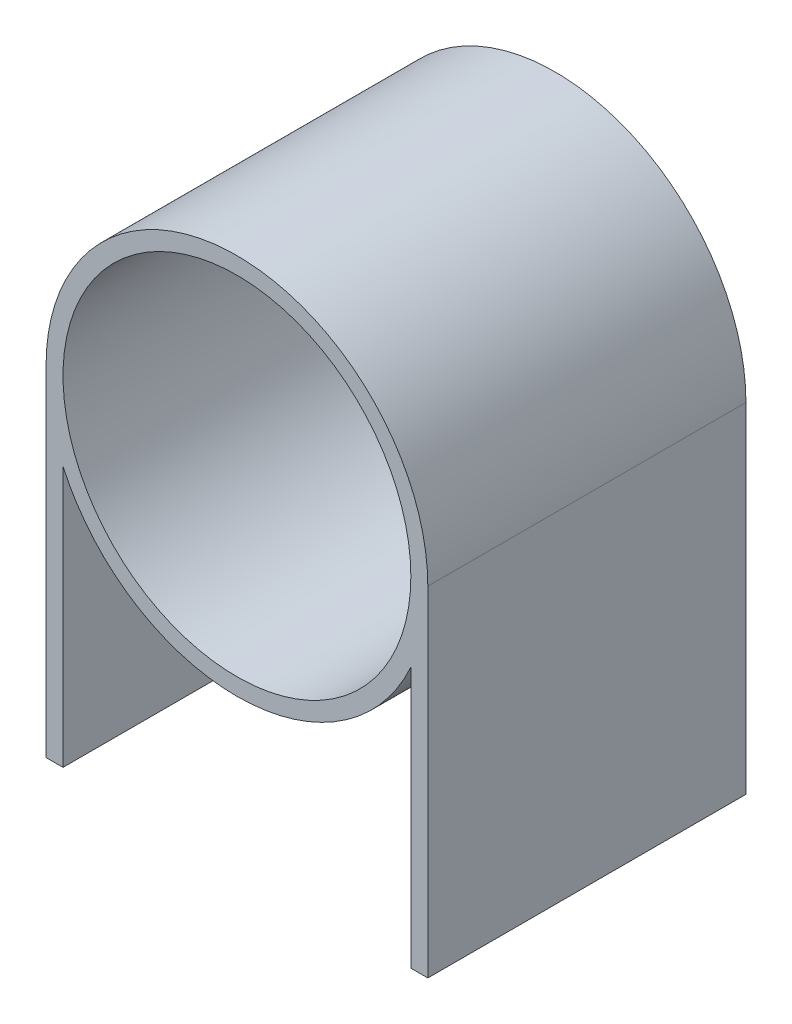
ISO-10303-21;
HEADER;
FILE_DESCRIPTION(('STEP AP214'),'2;1');
FILE_NAME('part.step','',(''),(''),'','','');
FILE_SCHEMA(('AUTOMOTIVE_DESIGN { 1 0 10303 214 1 1 1 1 }'));
ENDSEC;
DATA;
#1=APPLICATION_CONTEXT('core data for automotive mechanical design processes');
#2=APPLICATION_PROTOCOL_DEFINITION('international standard','automotive_design',2000,#1);
#3=PRODUCT_CONTEXT('',#1,'mechanical');
#4=PRODUCT('Part','Part','',(#3));
#5=PRODUCT_RELATED_PRODUCT_CATEGORY('part','',(#4));
#6=PRODUCT_DEFINITION_FORMATION('','',#4);
#7=PRODUCT_DEFINITION_CONTEXT('part definition',#1,'design');
#8=PRODUCT_DEFINITION('design','',#6,#7);
#9=PRODUCT_DEFINITION_SHAPE('','',#8);
#10=(LENGTH_UNIT() NAMED_UNIT(*) SI_UNIT(.MILLI.,.METRE.));
#11=(NAMED_UNIT(*) PLANE_ANGLE_UNIT() SI_UNIT($,.RADIAN.));
#12=(NAMED_UNIT(*) SI_UNIT($,.STERADIAN.) SOLID_ANGLE_UNIT());
#13=UNCERTAINTY_MEASURE_WITH_UNIT(LENGTH_MEASURE(1.E-05),#10,'distance_accuracy_value','');
#14=(GEOMETRIC_REPRESENTATION_CONTEXT(3) GLOBAL_UNCERTAINTY_ASSIGNED_CONTEXT((#13)) GLOBAL_UNIT_ASSIGNED_CONTEXT((#10,
#11,#12)) REPRESENTATION_CONTEXT('',''));
#15=CARTESIAN_POINT('',(0.,0.,0.));
#16=DIRECTION('',(0.,0.,1.));
#17=DIRECTION('',(1.,0.,0.));
#18=AXIS2_PLACEMENT_3D('',#15,#16,#17);
#19=CARTESIAN_POINT('',(-18.,-32.,30.));
#20=DIRECTION('',(0.,1.,0.));
#21=DIRECTION('',(-1.,0.,0.));
#22=AXIS2_PLACEMENT_3D('',#19,#20,#21);
#23=PLANE('',#22);
#24=DIRECTION('',(0.,0.,-1.));
#25=VECTOR('',#24,1.);
#26=CARTESIAN_POINT('',(-16.4,-32.,30.));
#27=LINE('',#26,#25);
#28=CARTESIAN_POINT('',(-16.4,-32.,30.));
#29=VERTEX_POINT('',#28);
#30=CARTESIAN_POINT('',(-16.4,-32.,1.6));
#31=VERTEX_POINT('',#30);
#32=EDGE_CURVE('E103',#29,#31,#27,.T.);
#33=ORIENTED_EDGE('',*,*,#32,.F.);
#34=DIRECTION('',(1.,0.,0.));
#35=VECTOR('',#34,1.);
#36=CARTESIAN_POINT('',(-18.,-32.,30.));
#37=LINE('',#36,#35);
#38=CARTESIAN_POINT('',(-18.,-32.,30.));
#39=VERTEX_POINT('',#38);
#40=EDGE_CURVE('E115',#39,#29,#37,.T.);
#41=ORIENTED_EDGE('',*,*,#40,.F.);
#42=DIRECTION('',(0.,0.,-1.));
#43=VECTOR('',#42,1.);
#44=CARTESIAN_POINT('',(-18.,-32.,30.));
#45=LINE('',#44,#43);
#46=CARTESIAN_POINT('',(-18.,-32.,0.));
#47=VERTEX_POINT('',#46);
#48=EDGE_CURVE('E60',#39,#47,#45,.T.);
#49=ORIENTED_EDGE('',*,*,#48,.T.);
#50=DIRECTION('',(1.,0.,0.));
#51=VECTOR('',#50,1.);
#52=CARTESIAN_POINT('',(-18.,-32.,0.));
#53=LINE('',#52,#51);
#54=CARTESIAN_POINT('',(18.,-32.,0.));
#55=VERTEX_POINT('',#54);
#56=EDGE_CURVE('E233',#47,#55,#53,.T.);
#57=ORIENTED_EDGE('',*,*,#56,.T.);
#58=DIRECTION('',(0.,0.,-1.));
#59=VECTOR('',#58,1.);
#60=CARTESIAN_POINT('',(18.,-32.,30.));
#61=LINE('',#60,#59);
#62=CARTESIAN_POINT('',(18.,-32.,30.));
#63=VERTEX_POINT('',#62);
#64=EDGE_CURVE('E243',#63,#55,#61,.T.);
#65=ORIENTED_EDGE('',*,*,#64,.F.);
#66=CARTESIAN_POINT('',(16.4,-32.,30.));
#67=VERTEX_POINT('',#66);
#68=EDGE_CURVE('E219',#67,#63,#37,.T.);
#69=ORIENTED_EDGE('',*,*,#68,.F.);
#70=DIRECTION('',(0.,0.,-1.));
#71=VECTOR('',#70,1.);
#72=CARTESIAN_POINT('',(16.4,-32.,30.));
#73=LINE('',#72,#71);
#74=CARTESIAN_POINT('',(16.4,-32.,1.6));
#75=VERTEX_POINT('',#74);
#76=EDGE_CURVE('E128',#67,#75,#73,.T.);
#77=ORIENTED_EDGE('',*,*,#76,.T.);
#78=DIRECTION('',(1.,0.,0.));
#79=VECTOR('',#78,1.);
#80=CARTESIAN_POINT('',(0.,-32.,1.6));
#81=LINE('',#80,#79);
#82=EDGE_CURVE('E120',#31,#75,#81,.T.);
#83=ORIENTED_EDGE('',*,*,#82,.F.);
#84=EDGE_LOOP('',(#33,#41,#49,#57,#65,#69,#77,#83));
#85=FACE_BOUND('',#84,.T.);
#86=ADVANCED_FACE('F49',(#85),#23,.F.);
#87=CARTESIAN_POINT('',(0.,0.,3.));
#88=DIRECTION('',(0.,0.,1.));
#89=DIRECTION('',(1.,0.,0.));
#90=AXIS2_PLACEMENT_3D('',#87,#88,#89);
#91=PLANE('',#90);
#92=CARTESIAN_POINT('',(1.27,0.,3.));
#93=DIRECTION('',(0.,0.,1.));
#94=DIRECTION('',(1.,0.,0.));
#95=AXIS2_PLACEMENT_3D('',#92,#93,#94);
#96=CIRCLE('',#95,0.75);
#97=CARTESIAN_POINT('',(2.02,0.,3.));
#98=VERTEX_POINT('',#97);
#99=EDGE_CURVE('E192',#98,#98,#96,.T.);
#100=ORIENTED_EDGE('',*,*,#99,.F.);
#101=EDGE_LOOP('',(#100));
#102=FACE_BOUND('',#101,.T.);
#103=CARTESIAN_POINT('',(-1.27,0.,3.));
#104=DIRECTION('',(0.,0.,1.));
#105=DIRECTION('',(1.,0.,0.));
#106=AXIS2_PLACEMENT_3D('',#103,#104,#105);
#107=CIRCLE('',#106,0.75);
#108=CARTESIAN_POINT('',(-0.52,0.,3.));
#109=VERTEX_POINT('',#108);
#110=EDGE_CURVE('E196',#109,#109,#107,.T.);
#111=ORIENTED_EDGE('',*,*,#110,.F.);
#112=EDGE_LOOP('',(#111));
#113=FACE_BOUND('',#112,.T.);
#114=CARTESIAN_POINT('',(0.,0.,3.));
#115=DIRECTION('',(0.,0.,1.));
#116=DIRECTION('',(1.,0.,0.));
#117=AXIS2_PLACEMENT_3D('',#114,#115,#116);
#118=CIRCLE('',#117,16.4);
#119=CARTESIAN_POINT('',(16.4,0.,3.));
#120=VERTEX_POINT('',#119);
#121=EDGE_CURVE('E203',#120,#120,#118,.T.);
#122=ORIENTED_EDGE('',*,*,#121,.T.);
#123=EDGE_LOOP('',(#122));
#124=FACE_BOUND('',#123,.T.);
#125=DIRECTION('',(0.,1.,0.));
#126=VECTOR('',#125,1.);
#127=CARTESIAN_POINT('',(2.5,0.,3.));
#128=LINE('',#127,#126);
#129=CARTESIAN_POINT('',(2.5,-3.475,3.));
#130=VERTEX_POINT('',#129);
#131=CARTESIAN_POINT('',(2.5,-1.475,3.));
#132=VERTEX_POINT('',#131);
#133=EDGE_CURVE('E164',#130,#132,#128,.T.);
#134=ORIENTED_EDGE('',*,*,#133,.F.);
#135=DIRECTION('',(1.,0.,0.));
#136=VECTOR('',#135,1.);
#137=CARTESIAN_POINT('',(0.,-3.475,3.));
#138=LINE('',#137,#136);
#139=CARTESIAN_POINT('',(-2.5,-3.475,3.));
#140=VERTEX_POINT('',#139);
#141=EDGE_CURVE('E142',#140,#130,#138,.T.);
#142=ORIENTED_EDGE('',*,*,#141,.F.);
#143=DIRECTION('',(0.,-1.,0.));
#144=VECTOR('',#143,1.);
#145=CARTESIAN_POINT('',(-2.5,0.,3.));
#146=LINE('',#145,#144);
#147=CARTESIAN_POINT('',(-2.5,-1.475,3.));
#148=VERTEX_POINT('',#147);
#149=EDGE_CURVE('E148',#148,#140,#146,.T.);
#150=ORIENTED_EDGE('',*,*,#149,.F.);
#151=DIRECTION('',(-1.,0.,0.));
#152=VECTOR('',#151,1.);
#153=CARTESIAN_POINT('',(0.,-1.475,3.));
#154=LINE('',#153,#152);
#155=EDGE_CURVE('E168',#132,#148,#154,.T.);
#156=ORIENTED_EDGE('',*,*,#155,.F.);
#157=EDGE_LOOP('',(#134,#142,#150,#156));
#158=FACE_BOUND('',#157,.T.);
#159=ADVANCED_FACE('F326',(#102,#113,#124,#158),#91,.T.);
#160=CARTESIAN_POINT('',(0.,0.,30.));
#161=DIRECTION('',(0.,0.,-1.));
#162=DIRECTION('',(-1.,0.,0.));
#163=AXIS2_PLACEMENT_3D('',#160,#161,#162);
#164=CYLINDRICAL_SURFACE('',#163,18.);
#165=CARTESIAN_POINT('',(0.,0.,0.));
#166=DIRECTION('',(0.,0.,1.));
#167=DIRECTION('',(-1.,0.,0.));
#168=AXIS2_PLACEMENT_3D('',#165,#166,#167);
#169=CIRCLE('',#168,18.);
#170=CARTESIAN_POINT('',(18.,0.,0.));
#171=VERTEX_POINT('',#170);
#172=CARTESIAN_POINT('',(-18.,0.,0.));
#173=VERTEX_POINT('',#172);
#174=EDGE_CURVE('E207',#171,#173,#169,.T.);
#175=ORIENTED_EDGE('',*,*,#174,.T.);
#176=DIRECTION('',(0.,0.,-1.));
#177=VECTOR('',#176,1.);
#178=CARTESIAN_POINT('',(-18.,0.,30.));
#179=LINE('',#178,#177);
#180=CARTESIAN_POINT('',(-18.,0.,30.));
#181=VERTEX_POINT('',#180);
#182=EDGE_CURVE('E11',#181,#173,#179,.T.);
#183=ORIENTED_EDGE('',*,*,#182,.F.);
#184=CARTESIAN_POINT('',(0.,0.,30.));
#185=DIRECTION('',(0.,0.,1.));
#186=DIRECTION('',(-1.,0.,0.));
#187=AXIS2_PLACEMENT_3D('',#184,#185,#186);
#188=CIRCLE('',#187,18.);
#189=CARTESIAN_POINT('',(18.,0.,30.));
#190=VERTEX_POINT('',#189);
#191=EDGE_CURVE('E211',#190,#181,#188,.T.);
#192=ORIENTED_EDGE('',*,*,#191,.F.);
#193=DIRECTION('',(0.,0.,-1.));
#194=VECTOR('',#193,1.);
#195=CARTESIAN_POINT('',(18.,0.,30.));
#196=LINE('',#195,#194);
#197=EDGE_CURVE('E225',#190,#171,#196,.T.);
#198=ORIENTED_EDGE('',*,*,#197,.T.);
#199=EDGE_LOOP('',(#175,#183,#192,#198));
#200=FACE_BOUND('',#199,.T.);
#201=ADVANCED_FACE('F51',(#200),#164,.T.);
#202=CARTESIAN_POINT('',(-18.,0.,30.));
#203=DIRECTION('',(1.,0.,0.));
#204=DIRECTION('',(0.,1.,0.));
#205=AXIS2_PLACEMENT_3D('',#202,#203,#204);
#206=PLANE('',#205);
#207=DIRECTION('',(0.,-1.,0.));
#208=VECTOR('',#207,1.);
#209=CARTESIAN_POINT('',(-18.,0.,0.));
#210=LINE('',#209,#208);
#211=EDGE_CURVE('E229',#173,#47,#210,.T.);
#212=ORIENTED_EDGE('',*,*,#211,.T.);
#213=ORIENTED_EDGE('',*,*,#48,.F.);
#214=DIRECTION('',(0.,-1.,0.));
#215=VECTOR('',#214,1.);
#216=CARTESIAN_POINT('',(-18.,0.,30.));
#217=LINE('',#216,#215);
#218=EDGE_CURVE('E215',#181,#39,#217,.T.);
#219=ORIENTED_EDGE('',*,*,#218,.F.);
#220=ORIENTED_EDGE('',*,*,#182,.T.);
#221=EDGE_LOOP('',(#212,#213,#219,#220));
#222=FACE_BOUND('',#221,.T.);
#223=ADVANCED_FACE('F335',(#222),#206,.F.);
#224=CARTESIAN_POINT('',(18.,-32.,30.));
#225=DIRECTION('',(-1.,0.,0.));
#226=DIRECTION('',(0.,-1.,0.));
#227=AXIS2_PLACEMENT_3D('',#224,#225,#226);
#228=PLANE('',#227);
#229=DIRECTION('',(0.,1.,0.));
#230=VECTOR('',#229,1.);
#231=CARTESIAN_POINT('',(18.,-32.,0.));
#232=LINE('',#231,#230);
#233=EDGE_CURVE('E216',#55,#171,#232,.T.);
#234=ORIENTED_EDGE('',*,*,#233,.T.);
#235=ORIENTED_EDGE('',*,*,#197,.F.);
#236=DIRECTION('',(0.,1.,0.));
#237=VECTOR('',#236,1.);
#238=CARTESIAN_POINT('',(18.,-32.,30.));
#239=LINE('',#238,#237);
#240=EDGE_CURVE('E222',#63,#190,#239,.T.);
#241=ORIENTED_EDGE('',*,*,#240,.F.);
#242=ORIENTED_EDGE('',*,*,#64,.T.);
#243=EDGE_LOOP('',(#234,#235,#241,#242));
#244=FACE_BOUND('',#243,.T.);
#245=ADVANCED_FACE('F268',(#244),#228,.F.);
#246=CARTESIAN_POINT('',(0.,0.,30.));
#247=DIRECTION('',(0.,0.,-1.));
#248=DIRECTION('',(-1.,0.,0.));
#249=AXIS2_PLACEMENT_3D('',#246,#247,#248);
#250=PLANE('',#249);
#251=DIRECTION('',(0.,-1.,0.));
#252=VECTOR('',#251,1.);
#253=CARTESIAN_POINT('',(-16.4,0.,30.));
#254=LINE('',#253,#252);
#255=CARTESIAN_POINT('',(-16.4,-7.41889479639655,30.));
#256=VERTEX_POINT('',#255);
#257=EDGE_CURVE('E97',#256,#29,#254,.T.);
#258=ORIENTED_EDGE('',*,*,#257,.F.);
#259=CARTESIAN_POINT('',(0.,0.,30.));
#260=DIRECTION('',(0.,0.,1.));
#261=DIRECTION('',(1.,0.,0.));
#262=AXIS2_PLACEMENT_3D('',#259,#260,#261);
#263=CIRCLE('',#262,18.);
#264=CARTESIAN_POINT('',(16.4,-7.41889479639657,30.));
#265=VERTEX_POINT('',#264);
#266=EDGE_CURVE('E53',#265,#256,#263,.F.);
#267=ORIENTED_EDGE('',*,*,#266,.F.);
#268=DIRECTION('',(0.,1.,0.));
#269=VECTOR('',#268,1.);
#270=CARTESIAN_POINT('',(16.4,0.,30.));
#271=LINE('',#270,#269);
#272=EDGE_CURVE('E110',#67,#265,#271,.T.);
#273=ORIENTED_EDGE('',*,*,#272,.F.);
#274=ORIENTED_EDGE('',*,*,#68,.T.);
#275=ORIENTED_EDGE('',*,*,#240,.T.);
#276=ORIENTED_EDGE('',*,*,#191,.T.);
#277=ORIENTED_EDGE('',*,*,#218,.T.);
#278=ORIENTED_EDGE('',*,*,#40,.T.);
#279=EDGE_LOOP('',(#258,#267,#273,#274,#275,#276,#277,#278));
#280=FACE_BOUND('',#279,.T.);
#281=CARTESIAN_POINT('',(0.,0.,30.));
#282=DIRECTION('',(0.,0.,1.));
#283=DIRECTION('',(1.,0.,0.));
#284=AXIS2_PLACEMENT_3D('',#281,#282,#283);
#285=CIRCLE('',#284,16.4);
#286=CARTESIAN_POINT('',(16.4,0.,30.));
#287=VERTEX_POINT('',#286);
#288=EDGE_CURVE('E191',#287,#287,#285,.T.);
#289=ORIENTED_EDGE('',*,*,#288,.F.);
#290=EDGE_LOOP('',(#289));
#291=FACE_BOUND('',#290,.T.);
#292=ADVANCED_FACE('F111',(#280,#291),#250,.F.);
#293=CARTESIAN_POINT('',(0.,0.,0.));
#294=DIRECTION('',(0.,0.,-1.));
#295=DIRECTION('',(-1.,0.,0.));
#296=AXIS2_PLACEMENT_3D('',#293,#294,#295);
#297=PLANE('',#296);
#298=CARTESIAN_POINT('',(1.27,0.,0.));
#299=DIRECTION('',(0.,0.,1.));
#300=DIRECTION('',(1.,0.,0.));
#301=AXIS2_PLACEMENT_3D('',#298,#299,#300);
#302=CIRCLE('',#301,0.75);
#303=CARTESIAN_POINT('',(2.02,0.,0.));
#304=VERTEX_POINT('',#303);
#305=EDGE_CURVE('E187',#304,#304,#302,.T.);
#306=ORIENTED_EDGE('',*,*,#305,.T.);
#307=EDGE_LOOP('',(#306));
#308=FACE_BOUND('',#307,.T.);
#309=CARTESIAN_POINT('',(-1.27,0.,0.));
#310=DIRECTION('',(0.,0.,1.));
#311=DIRECTION('',(1.,0.,0.));
#312=AXIS2_PLACEMENT_3D('',#309,#310,#311);
#313=CIRCLE('',#312,0.75);
#314=CARTESIAN_POINT('',(-0.52,0.,0.));
#315=VERTEX_POINT('',#314);
#316=EDGE_CURVE('E186',#315,#315,#313,.T.);
#317=ORIENTED_EDGE('',*,*,#316,.T.);
#318=EDGE_LOOP('',(#317));
#319=FACE_BOUND('',#318,.T.);
#320=ORIENTED_EDGE('',*,*,#174,.F.);
#321=ORIENTED_EDGE('',*,*,#233,.F.);
#322=ORIENTED_EDGE('',*,*,#56,.F.);
#323=ORIENTED_EDGE('',*,*,#211,.F.);
#324=EDGE_LOOP('',(#320,#321,#322,#323));
#325=FACE_BOUND('',#324,.T.);
#326=ADVANCED_FACE('F265',(#308,#319,#325),#297,.T.);
#327=CARTESIAN_POINT('',(0.,0.,3.));
#328=DIRECTION('',(0.,0.,1.));
#329=DIRECTION('',(1.,0.,0.));
#330=AXIS2_PLACEMENT_3D('',#327,#328,#329);
#331=CYLINDRICAL_SURFACE('',#330,16.4);
#332=ORIENTED_EDGE('',*,*,#288,.T.);
#333=EDGE_LOOP('',(#332));
#334=FACE_BOUND('',#333,.T.);
#335=ORIENTED_EDGE('',*,*,#121,.F.);
#336=EDGE_LOOP('',(#335));
#337=FACE_BOUND('',#336,.T.);
#338=ADVANCED_FACE('F360',(#334,#337),#331,.F.);
#339=CARTESIAN_POINT('',(-1.27,0.,0.));
#340=DIRECTION('',(0.,0.,1.));
#341=DIRECTION('',(1.,0.,0.));
#342=AXIS2_PLACEMENT_3D('',#339,#340,#341);
#343=CYLINDRICAL_SURFACE('',#342,0.75);
#344=ORIENTED_EDGE('',*,*,#316,.F.);
#345=EDGE_LOOP('',(#344));
#346=FACE_BOUND('',#345,.T.);
#347=ORIENTED_EDGE('',*,*,#110,.T.);
#348=EDGE_LOOP('',(#347));
#349=FACE_BOUND('',#348,.T.);
#350=ADVANCED_FACE('F351',(#346,#349),#343,.F.);
#351=CARTESIAN_POINT('',(1.27,0.,0.));
#352=DIRECTION('',(0.,0.,1.));
#353=DIRECTION('',(1.,0.,0.));
#354=AXIS2_PLACEMENT_3D('',#351,#352,#353);
#355=CYLINDRICAL_SURFACE('',#354,0.75);
#356=ORIENTED_EDGE('',*,*,#305,.F.);
#357=EDGE_LOOP('',(#356));
#358=FACE_BOUND('',#357,.T.);
#359=ORIENTED_EDGE('',*,*,#99,.T.);
#360=EDGE_LOOP('',(#359));
#361=FACE_BOUND('',#360,.T.);
#362=ADVANCED_FACE('F346',(#358,#361),#355,.F.);
#363=CARTESIAN_POINT('',(0.,-3.475,7.));
#364=DIRECTION('',(0.,1.,0.));
#365=DIRECTION('',(-1.,0.,0.));
#366=AXIS2_PLACEMENT_3D('',#363,#364,#365);
#367=PLANE('',#366);
#368=ORIENTED_EDGE('',*,*,#141,.T.);
#369=DIRECTION('',(0.,0.,-1.));
#370=VECTOR('',#369,1.);
#371=CARTESIAN_POINT('',(2.5,-3.475,7.));
#372=LINE('',#371,#370);
#373=CARTESIAN_POINT('',(2.5,-3.475,7.));
#374=VERTEX_POINT('',#373);
#375=EDGE_CURVE('E182',#374,#130,#372,.T.);
#376=ORIENTED_EDGE('',*,*,#375,.F.);
#377=DIRECTION('',(1.,0.,0.));
#378=VECTOR('',#377,1.);
#379=CARTESIAN_POINT('',(0.,-3.475,7.));
#380=LINE('',#379,#378);
#381=CARTESIAN_POINT('',(-2.5,-3.475,7.));
#382=VERTEX_POINT('',#381);
#383=EDGE_CURVE('E143',#382,#374,#380,.T.);
#384=ORIENTED_EDGE('',*,*,#383,.F.);
#385=DIRECTION('',(0.,0.,-1.));
#386=VECTOR('',#385,1.);
#387=CARTESIAN_POINT('',(-2.5,-3.475,7.));
#388=LINE('',#387,#386);
#389=EDGE_CURVE('E160',#382,#140,#388,.T.);
#390=ORIENTED_EDGE('',*,*,#389,.T.);
#391=EDGE_LOOP('',(#368,#376,#384,#390));
#392=FACE_BOUND('',#391,.T.);
#393=ADVANCED_FACE('F350',(#392),#367,.F.);
#394=CARTESIAN_POINT('',(2.5,0.,7.));
#395=DIRECTION('',(-1.,0.,0.));
#396=DIRECTION('',(0.,0.,1.));
#397=AXIS2_PLACEMENT_3D('',#394,#395,#396);
#398=PLANE('',#397);
#399=ORIENTED_EDGE('',*,*,#133,.T.);
#400=DIRECTION('',(0.,0.,-1.));
#401=VECTOR('',#400,1.);
#402=CARTESIAN_POINT('',(2.5,-1.475,7.));
#403=LINE('',#402,#401);
#404=CARTESIAN_POINT('',(2.5,-1.475,7.));
#405=VERTEX_POINT('',#404);
#406=EDGE_CURVE('E178',#405,#132,#403,.T.);
#407=ORIENTED_EDGE('',*,*,#406,.F.);
#408=DIRECTION('',(0.,1.,0.));
#409=VECTOR('',#408,1.);
#410=CARTESIAN_POINT('',(2.5,0.,7.));
#411=LINE('',#410,#409);
#412=EDGE_CURVE('E147',#374,#405,#411,.T.);
#413=ORIENTED_EDGE('',*,*,#412,.F.);
#414=ORIENTED_EDGE('',*,*,#375,.T.);
#415=EDGE_LOOP('',(#399,#407,#413,#414));
#416=FACE_BOUND('',#415,.T.);
#417=ADVANCED_FACE('F376',(#416),#398,.F.);
#418=CARTESIAN_POINT('',(0.,-1.475,7.));
#419=DIRECTION('',(0.,-1.,0.));
#420=DIRECTION('',(1.,0.,0.));
#421=AXIS2_PLACEMENT_3D('',#418,#419,#420);
#422=PLANE('',#421);
#423=ORIENTED_EDGE('',*,*,#155,.T.);
#424=DIRECTION('',(0.,0.,-1.));
#425=VECTOR('',#424,1.);
#426=CARTESIAN_POINT('',(-2.5,-1.475,7.));
#427=LINE('',#426,#425);
#428=CARTESIAN_POINT('',(-2.5,-1.475,7.));
#429=VERTEX_POINT('',#428);
#430=EDGE_CURVE('E68',#429,#148,#427,.T.);
#431=ORIENTED_EDGE('',*,*,#430,.F.);
#432=DIRECTION('',(-1.,0.,0.));
#433=VECTOR('',#432,1.);
#434=CARTESIAN_POINT('',(0.,-1.475,7.));
#435=LINE('',#434,#433);
#436=EDGE_CURVE('E152',#405,#429,#435,.T.);
#437=ORIENTED_EDGE('',*,*,#436,.F.);
#438=ORIENTED_EDGE('',*,*,#406,.T.);
#439=EDGE_LOOP('',(#423,#431,#437,#438));
#440=FACE_BOUND('',#439,.T.);
#441=ADVANCED_FACE('F380',(#440),#422,.F.);
#442=CARTESIAN_POINT('',(-2.5,0.,7.));
#443=DIRECTION('',(1.,0.,0.));
#444=DIRECTION('',(0.,1.,0.));
#445=AXIS2_PLACEMENT_3D('',#442,#443,#444);
#446=PLANE('',#445);
#447=ORIENTED_EDGE('',*,*,#149,.T.);
#448=ORIENTED_EDGE('',*,*,#389,.F.);
#449=DIRECTION('',(0.,-1.,0.));
#450=VECTOR('',#449,1.);
#451=CARTESIAN_POINT('',(-2.5,0.,7.));
#452=LINE('',#451,#450);
#453=EDGE_CURVE('E156',#429,#382,#452,.T.);
#454=ORIENTED_EDGE('',*,*,#453,.F.);
#455=ORIENTED_EDGE('',*,*,#430,.T.);
#456=EDGE_LOOP('',(#447,#448,#454,#455));
#457=FACE_BOUND('',#456,.T.);
#458=ADVANCED_FACE('F385',(#457),#446,.F.);
#459=CARTESIAN_POINT('',(0.,0.,7.));
#460=DIRECTION('',(0.,0.,1.));
#461=DIRECTION('',(1.,0.,0.));
#462=AXIS2_PLACEMENT_3D('',#459,#460,#461);
#463=PLANE('',#462);
#464=ORIENTED_EDGE('',*,*,#383,.T.);
#465=ORIENTED_EDGE('',*,*,#412,.T.);
#466=ORIENTED_EDGE('',*,*,#436,.T.);
#467=ORIENTED_EDGE('',*,*,#453,.T.);
#468=EDGE_LOOP('',(#464,#465,#466,#467));
#469=FACE_BOUND('',#468,.T.);
#470=ADVANCED_FACE('F389',(#469),#463,.T.);
#471=CARTESIAN_POINT('',(0.,0.,3.));
#472=DIRECTION('',(0.,0.,1.));
#473=DIRECTION('',(1.,0.,0.));
#474=AXIS2_PLACEMENT_3D('',#471,#472,#473);
#475=CYLINDRICAL_SURFACE('',#474,18.);
#476=CARTESIAN_POINT('',(0.,0.,1.6));
#477=DIRECTION('',(0.,0.,-1.));
#478=DIRECTION('',(-1.,0.,0.));
#479=AXIS2_PLACEMENT_3D('',#476,#477,#478);
#480=CIRCLE('',#479,18.);
#481=CARTESIAN_POINT('',(-16.4,-7.41889479639656,1.6));
#482=VERTEX_POINT('',#481);
#483=CARTESIAN_POINT('',(16.4,-7.41889479639656,1.6));
#484=VERTEX_POINT('',#483);
#485=EDGE_CURVE('E139',#482,#484,#480,.F.);
#486=ORIENTED_EDGE('',*,*,#485,.T.);
#487=DIRECTION('',(0.,0.,1.));
#488=VECTOR('',#487,1.);
#489=CARTESIAN_POINT('',(16.4,-7.41889479639656,3.));
#490=LINE('',#489,#488);
#491=EDGE_CURVE('E83',#265,#484,#490,.F.);
#492=ORIENTED_EDGE('',*,*,#491,.F.);
#493=ORIENTED_EDGE('',*,*,#266,.T.);
#494=DIRECTION('',(0.,0.,1.));
#495=VECTOR('',#494,1.);
#496=CARTESIAN_POINT('',(-16.4,-7.41889479639656,3.));
#497=LINE('',#496,#495);
#498=EDGE_CURVE('E93',#256,#482,#497,.F.);
#499=ORIENTED_EDGE('',*,*,#498,.T.);
#500=EDGE_LOOP('',(#486,#492,#493,#499));
#501=FACE_BOUND('',#500,.T.);
#502=ADVANCED_FACE('F106',(#501),#475,.T.);
#503=CARTESIAN_POINT('',(-16.4,0.,30.));
#504=DIRECTION('',(1.,0.,0.));
#505=DIRECTION('',(0.,1.,0.));
#506=AXIS2_PLACEMENT_3D('',#503,#504,#505);
#507=PLANE('',#506);
#508=ORIENTED_EDGE('',*,*,#498,.F.);
#509=ORIENTED_EDGE('',*,*,#257,.T.);
#510=ORIENTED_EDGE('',*,*,#32,.T.);
#511=DIRECTION('',(0.,-1.,0.));
#512=VECTOR('',#511,1.);
#513=CARTESIAN_POINT('',(-16.4,0.,1.6));
#514=LINE('',#513,#512);
#515=EDGE_CURVE('E101',#482,#31,#514,.T.);
#516=ORIENTED_EDGE('',*,*,#515,.F.);
#517=EDGE_LOOP('',(#508,#509,#510,#516));
#518=FACE_BOUND('',#517,.T.);
#519=ADVANCED_FACE('F94',(#518),#507,.T.);
#520=CARTESIAN_POINT('',(16.4,-32.,30.));
#521=DIRECTION('',(-1.,0.,0.));
#522=DIRECTION('',(0.,-1.,0.));
#523=AXIS2_PLACEMENT_3D('',#520,#521,#522);
#524=PLANE('',#523);
#525=ORIENTED_EDGE('',*,*,#491,.T.);
#526=DIRECTION('',(0.,1.,0.));
#527=VECTOR('',#526,1.);
#528=CARTESIAN_POINT('',(16.4,0.,1.6));
#529=LINE('',#528,#527);
#530=EDGE_CURVE('E124',#75,#484,#529,.T.);
#531=ORIENTED_EDGE('',*,*,#530,.F.);
#532=ORIENTED_EDGE('',*,*,#76,.F.);
#533=ORIENTED_EDGE('',*,*,#272,.T.);
#534=EDGE_LOOP('',(#525,#531,#532,#533));
#535=FACE_BOUND('',#534,.T.);
#536=ADVANCED_FACE('F315',(#535),#524,.T.);
#537=CARTESIAN_POINT('',(0.,0.,1.6));
#538=DIRECTION('',(0.,0.,-1.));
#539=DIRECTION('',(-1.,0.,0.));
#540=AXIS2_PLACEMENT_3D('',#537,#538,#539);
#541=PLANE('',#540);
#542=ORIENTED_EDGE('',*,*,#515,.T.);
#543=ORIENTED_EDGE('',*,*,#82,.T.);
#544=ORIENTED_EDGE('',*,*,#530,.T.);
#545=ORIENTED_EDGE('',*,*,#485,.F.);
#546=EDGE_LOOP('',(#542,#543,#544,#545));
#547=FACE_BOUND('',#546,.T.);
#548=ADVANCED_FACE('F313',(#547),#541,.F.);
#549=CLOSED_SHELL('',(#86,#159,#201,#223,#245,#292,#326,#338,#350,#362,#393,#417,#441,#458,#470,
#502,#519,#536,#548));
#550=MANIFOLD_SOLID_BREP('B2',#549);
#551=ADVANCED_BREP_SHAPE_REPRESENTATION('',(#18,#550),#14);
#552=SHAPE_DEFINITION_REPRESENTATION(#9,#551);
ENDSEC;
END-ISO-10303-21;
